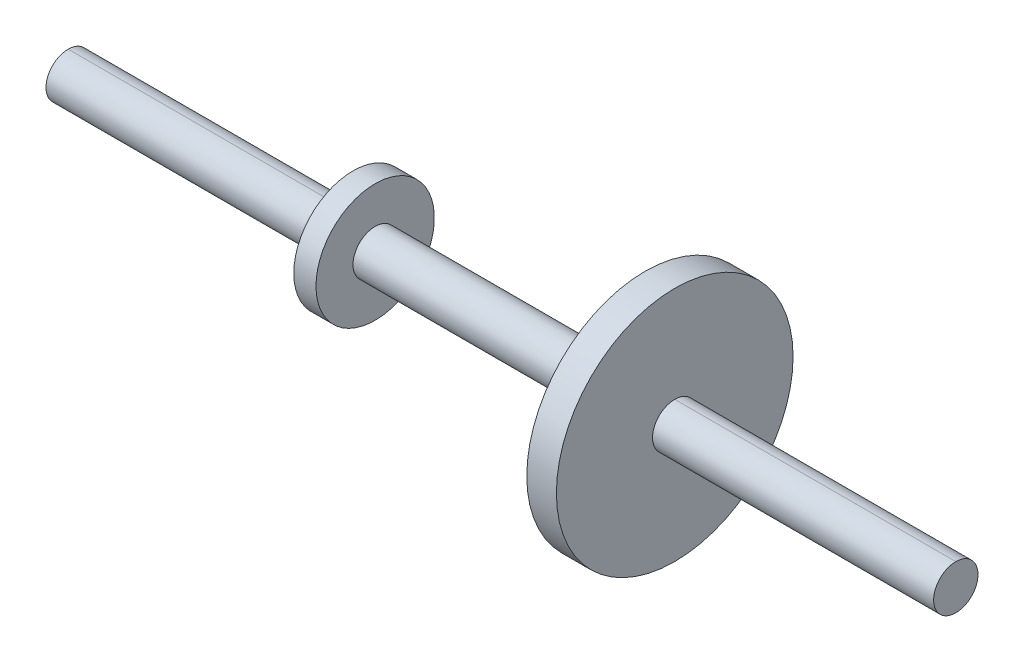
ISO-10303-21;
HEADER;
FILE_DESCRIPTION(('STEP AP214'),'2;1');
FILE_NAME('part.step','',(''),(''),'','','');
FILE_SCHEMA(('AUTOMOTIVE_DESIGN { 1 0 10303 214 1 1 1 1 }'));
ENDSEC;
DATA;
#1=APPLICATION_CONTEXT('core data for automotive mechanical design processes');
#2=APPLICATION_PROTOCOL_DEFINITION('international standard','automotive_design',2000,#1);
#3=PRODUCT_CONTEXT('',#1,'mechanical');
#4=PRODUCT('Part','Part','',(#3));
#5=PRODUCT_RELATED_PRODUCT_CATEGORY('part','',(#4));
#6=PRODUCT_DEFINITION_FORMATION('','',#4);
#7=PRODUCT_DEFINITION_CONTEXT('part definition',#1,'design');
#8=PRODUCT_DEFINITION('design','',#6,#7);
#9=PRODUCT_DEFINITION_SHAPE('','',#8);
#10=(LENGTH_UNIT() NAMED_UNIT(*) SI_UNIT(.MILLI.,.METRE.));
#11=(NAMED_UNIT(*) PLANE_ANGLE_UNIT() SI_UNIT($,.RADIAN.));
#12=(NAMED_UNIT(*) SI_UNIT($,.STERADIAN.) SOLID_ANGLE_UNIT());
#13=UNCERTAINTY_MEASURE_WITH_UNIT(LENGTH_MEASURE(1.E-05),#10,'distance_accuracy_value','');
#14=(GEOMETRIC_REPRESENTATION_CONTEXT(3) GLOBAL_UNCERTAINTY_ASSIGNED_CONTEXT((#13)) GLOBAL_UNIT_ASSIGNED_CONTEXT((#10,
#11,#12)) REPRESENTATION_CONTEXT('',''));
#15=CARTESIAN_POINT('',(0.,0.,0.));
#16=DIRECTION('',(0.,0.,1.));
#17=DIRECTION('',(1.,0.,0.));
#18=AXIS2_PLACEMENT_3D('',#15,#16,#17);
#19=CARTESIAN_POINT('',(0.,0.,0.));
#20=DIRECTION('',(-1.,0.,0.));
#21=DIRECTION('',(0.,0.,1.));
#22=AXIS2_PLACEMENT_3D('',#19,#20,#21);
#23=CYLINDRICAL_SURFACE('',#22,19.05);
#24=CARTESIAN_POINT('',(762.,0.,0.));
#25=DIRECTION('',(-1.,0.,0.));
#26=DIRECTION('',(0.,0.,1.));
#27=AXIS2_PLACEMENT_3D('',#24,#25,#26);
#28=CIRCLE('',#27,19.05);
#29=CARTESIAN_POINT('',(762.,19.05,0.));
#30=VERTEX_POINT('',#29);
#31=CARTESIAN_POINT('',(762.,-19.05,0.));
#32=VERTEX_POINT('',#31);
#33=EDGE_CURVE('E98',#30,#32,#28,.T.);
#34=ORIENTED_EDGE('',*,*,#33,.T.);
#35=DIRECTION('',(-1.,0.,0.));
#36=VECTOR('',#35,1.);
#37=CARTESIAN_POINT('',(0.,-19.05,0.));
#38=LINE('',#37,#36);
#39=CARTESIAN_POINT('',(520.7,-19.05,0.));
#40=VERTEX_POINT('',#39);
#41=EDGE_CURVE('E12',#32,#40,#38,.T.);
#42=ORIENTED_EDGE('',*,*,#41,.T.);
#43=CARTESIAN_POINT('',(520.7,0.,0.));
#44=DIRECTION('',(-1.,0.,0.));
#45=DIRECTION('',(0.,0.,1.));
#46=AXIS2_PLACEMENT_3D('',#43,#44,#45);
#47=CIRCLE('',#46,19.05);
#48=CARTESIAN_POINT('',(520.7,19.05,0.));
#49=VERTEX_POINT('',#48);
#50=EDGE_CURVE('E126',#49,#40,#47,.T.);
#51=ORIENTED_EDGE('',*,*,#50,.F.);
#52=DIRECTION('',(1.,0.,0.));
#53=VECTOR('',#52,1.);
#54=CARTESIAN_POINT('',(0.,19.05,0.));
#55=LINE('',#54,#53);
#56=EDGE_CURVE('E53',#49,#30,#55,.T.);
#57=ORIENTED_EDGE('',*,*,#56,.T.);
#58=EDGE_LOOP('',(#34,#42,#51,#57));
#59=FACE_BOUND('',#58,.T.);
#60=ADVANCED_FACE('F43',(#59),#23,.T.);
#61=CARTESIAN_POINT('',(0.,0.,0.));
#62=DIRECTION('',(-1.,0.,0.));
#63=DIRECTION('',(0.,0.,1.));
#64=AXIS2_PLACEMENT_3D('',#61,#62,#63);
#65=CYLINDRICAL_SURFACE('',#64,19.0499999999999);
#66=CARTESIAN_POINT('',(244.475,0.,0.));
#67=DIRECTION('',(-1.,0.,0.));
#68=DIRECTION('',(0.,0.,1.));
#69=AXIS2_PLACEMENT_3D('',#66,#67,#68);
#70=CIRCLE('',#69,19.0499999999999);
#71=CARTESIAN_POINT('',(244.475,-19.0499999999999,0.));
#72=VERTEX_POINT('',#71);
#73=CARTESIAN_POINT('',(244.475,19.0499999999999,0.));
#74=VERTEX_POINT('',#73);
#75=EDGE_CURVE('E101',#72,#74,#70,.T.);
#76=ORIENTED_EDGE('',*,*,#75,.T.);
#77=DIRECTION('',(-1.,0.,0.));
#78=VECTOR('',#77,1.);
#79=CARTESIAN_POINT('',(0.,19.0499999999999,0.));
#80=LINE('',#79,#78);
#81=CARTESIAN_POINT('',(0.,19.0499999999999,0.));
#82=VERTEX_POINT('',#81);
#83=EDGE_CURVE('E97',#74,#82,#80,.T.);
#84=ORIENTED_EDGE('',*,*,#83,.T.);
#85=CARTESIAN_POINT('',(0.,0.,0.));
#86=DIRECTION('',(-1.,0.,0.));
#87=DIRECTION('',(0.,0.,1.));
#88=AXIS2_PLACEMENT_3D('',#85,#86,#87);
#89=CIRCLE('',#88,19.0499999999999);
#90=CARTESIAN_POINT('',(0.,-19.0499999999999,0.));
#91=VERTEX_POINT('',#90);
#92=EDGE_CURVE('E86',#91,#82,#89,.T.);
#93=ORIENTED_EDGE('',*,*,#92,.F.);
#94=DIRECTION('',(1.,0.,0.));
#95=VECTOR('',#94,1.);
#96=CARTESIAN_POINT('',(0.,-19.0499999999999,0.));
#97=LINE('',#96,#95);
#98=EDGE_CURVE('E89',#91,#72,#97,.T.);
#99=ORIENTED_EDGE('',*,*,#98,.T.);
#100=EDGE_LOOP('',(#76,#84,#93,#99));
#101=FACE_BOUND('',#100,.T.);
#102=ADVANCED_FACE('F100',(#101),#65,.T.);
#103=CARTESIAN_POINT('',(0.,0.,-19.0499999999999));
#104=DIRECTION('',(1.,0.,0.));
#105=DIRECTION('',(0.,0.,-1.));
#106=AXIS2_PLACEMENT_3D('',#103,#104,#105);
#107=PLANE('',#106);
#108=ORIENTED_EDGE('',*,*,#92,.T.);
#109=EDGE_CURVE('E83',#82,#91,#89,.T.);
#110=ORIENTED_EDGE('',*,*,#109,.T.);
#111=EDGE_LOOP('',(#108,#110));
#112=FACE_BOUND('',#111,.T.);
#113=ADVANCED_FACE('F45',(#112),#107,.F.);
#114=CARTESIAN_POINT('',(762.,0.,0.));
#115=DIRECTION('',(-1.,0.,0.));
#116=DIRECTION('',(0.,0.,1.));
#117=AXIS2_PLACEMENT_3D('',#114,#115,#116);
#118=PLANE('',#117);
#119=ORIENTED_EDGE('',*,*,#33,.F.);
#120=EDGE_CURVE('E129',#32,#30,#28,.T.);
#121=ORIENTED_EDGE('',*,*,#120,.F.);
#122=EDGE_LOOP('',(#119,#121));
#123=FACE_BOUND('',#122,.T.);
#124=ADVANCED_FACE('F141',(#123),#118,.F.);
#125=ORIENTED_EDGE('',*,*,#41,.F.);
#126=ORIENTED_EDGE('',*,*,#120,.T.);
#127=ORIENTED_EDGE('',*,*,#56,.F.);
#128=EDGE_CURVE('E122',#40,#49,#47,.T.);
#129=ORIENTED_EDGE('',*,*,#128,.F.);
#130=EDGE_LOOP('',(#125,#126,#127,#129));
#131=FACE_BOUND('',#130,.T.);
#132=ADVANCED_FACE('F142',(#131),#23,.T.);
#133=CARTESIAN_POINT('',(520.7,0.,-19.05));
#134=DIRECTION('',(-1.,0.,0.));
#135=DIRECTION('',(0.,0.,1.));
#136=AXIS2_PLACEMENT_3D('',#133,#134,#135);
#137=PLANE('',#136);
#138=CARTESIAN_POINT('',(520.7,0.,0.));
#139=DIRECTION('',(-1.,0.,0.));
#140=DIRECTION('',(0.,0.,1.));
#141=AXIS2_PLACEMENT_3D('',#138,#139,#140);
#142=CIRCLE('',#141,101.6);
#143=CARTESIAN_POINT('',(520.7,0.,101.6));
#144=VERTEX_POINT('',#143);
#145=EDGE_CURVE('E118',#144,#144,#142,.T.);
#146=ORIENTED_EDGE('',*,*,#145,.F.);
#147=EDGE_LOOP('',(#146));
#148=FACE_BOUND('',#147,.T.);
#149=ORIENTED_EDGE('',*,*,#50,.T.);
#150=ORIENTED_EDGE('',*,*,#128,.T.);
#151=EDGE_LOOP('',(#149,#150));
#152=FACE_BOUND('',#151,.T.);
#153=ADVANCED_FACE('F144',(#148,#152),#137,.F.);
#154=CARTESIAN_POINT('',(0.,0.,0.));
#155=DIRECTION('',(-1.,0.,0.));
#156=DIRECTION('',(0.,0.,1.));
#157=AXIS2_PLACEMENT_3D('',#154,#155,#156);
#158=CYLINDRICAL_SURFACE('',#157,101.6);
#159=CARTESIAN_POINT('',(495.3,0.,0.));
#160=DIRECTION('',(-1.,0.,0.));
#161=DIRECTION('',(0.,0.,1.));
#162=AXIS2_PLACEMENT_3D('',#159,#160,#161);
#163=CIRCLE('',#162,101.6);
#164=CARTESIAN_POINT('',(495.3,0.,101.6));
#165=VERTEX_POINT('',#164);
#166=EDGE_CURVE('E123',#165,#165,#163,.T.);
#167=ORIENTED_EDGE('',*,*,#166,.F.);
#168=EDGE_LOOP('',(#167));
#169=FACE_BOUND('',#168,.T.);
#170=ORIENTED_EDGE('',*,*,#145,.T.);
#171=EDGE_LOOP('',(#170));
#172=FACE_BOUND('',#171,.T.);
#173=ADVANCED_FACE('F150',(#169,#172),#158,.T.);
#174=CARTESIAN_POINT('',(495.3,0.,-101.6));
#175=DIRECTION('',(1.,0.,0.));
#176=DIRECTION('',(0.,0.,-1.));
#177=AXIS2_PLACEMENT_3D('',#174,#175,#176);
#178=PLANE('',#177);
#179=CARTESIAN_POINT('',(495.3,0.,0.));
#180=DIRECTION('',(-1.,0.,0.));
#181=DIRECTION('',(0.,0.,1.));
#182=AXIS2_PLACEMENT_3D('',#179,#180,#181);
#183=CIRCLE('',#182,19.05);
#184=CARTESIAN_POINT('',(495.3,0.,19.05));
#185=VERTEX_POINT('',#184);
#186=EDGE_CURVE('E198',#185,#185,#183,.T.);
#187=ORIENTED_EDGE('',*,*,#186,.F.);
#188=EDGE_LOOP('',(#187));
#189=FACE_BOUND('',#188,.T.);
#190=ORIENTED_EDGE('',*,*,#166,.T.);
#191=EDGE_LOOP('',(#190));
#192=FACE_BOUND('',#191,.T.);
#193=ADVANCED_FACE('F183',(#189,#192),#178,.F.);
#194=CARTESIAN_POINT('',(0.,0.,0.));
#195=DIRECTION('',(-1.,0.,0.));
#196=DIRECTION('',(0.,0.,1.));
#197=AXIS2_PLACEMENT_3D('',#194,#195,#196);
#198=CYLINDRICAL_SURFACE('',#197,19.05);
#199=CARTESIAN_POINT('',(263.525,0.,0.));
#200=DIRECTION('',(-1.,0.,0.));
#201=DIRECTION('',(0.,0.,1.));
#202=AXIS2_PLACEMENT_3D('',#199,#200,#201);
#203=CIRCLE('',#202,19.0499999999999);
#204=CARTESIAN_POINT('',(263.525,0.,19.0499999999999));
#205=VERTEX_POINT('',#204);
#206=EDGE_CURVE('E200',#205,#205,#203,.T.);
#207=ORIENTED_EDGE('',*,*,#206,.F.);
#208=EDGE_LOOP('',(#207));
#209=FACE_BOUND('',#208,.T.);
#210=ORIENTED_EDGE('',*,*,#186,.T.);
#211=EDGE_LOOP('',(#210));
#212=FACE_BOUND('',#211,.T.);
#213=ADVANCED_FACE('F179',(#209,#212),#198,.T.);
#214=CARTESIAN_POINT('',(263.525,0.,-19.0499999999999));
#215=DIRECTION('',(-1.,0.,0.));
#216=DIRECTION('',(0.,0.,1.));
#217=AXIS2_PLACEMENT_3D('',#214,#215,#216);
#218=PLANE('',#217);
#219=CARTESIAN_POINT('',(263.525,0.,0.));
#220=DIRECTION('',(-1.,0.,0.));
#221=DIRECTION('',(0.,0.,1.));
#222=AXIS2_PLACEMENT_3D('',#219,#220,#221);
#223=CIRCLE('',#222,50.8);
#224=CARTESIAN_POINT('',(263.525,0.,50.8));
#225=VERTEX_POINT('',#224);
#226=EDGE_CURVE('E109',#225,#225,#223,.T.);
#227=ORIENTED_EDGE('',*,*,#226,.F.);
#228=EDGE_LOOP('',(#227));
#229=FACE_BOUND('',#228,.T.);
#230=ORIENTED_EDGE('',*,*,#206,.T.);
#231=EDGE_LOOP('',(#230));
#232=FACE_BOUND('',#231,.T.);
#233=ADVANCED_FACE('F172',(#229,#232),#218,.F.);
#234=CARTESIAN_POINT('',(0.,0.,0.));
#235=DIRECTION('',(-1.,0.,0.));
#236=DIRECTION('',(0.,0.,1.));
#237=AXIS2_PLACEMENT_3D('',#234,#235,#236);
#238=CYLINDRICAL_SURFACE('',#237,50.8);
#239=CARTESIAN_POINT('',(244.475,0.,0.));
#240=DIRECTION('',(-1.,0.,0.));
#241=DIRECTION('',(0.,0.,1.));
#242=AXIS2_PLACEMENT_3D('',#239,#240,#241);
#243=CIRCLE('',#242,50.8);
#244=CARTESIAN_POINT('',(244.475,0.,50.8));
#245=VERTEX_POINT('',#244);
#246=EDGE_CURVE('E105',#245,#245,#243,.T.);
#247=ORIENTED_EDGE('',*,*,#246,.F.);
#248=EDGE_LOOP('',(#247));
#249=FACE_BOUND('',#248,.T.);
#250=ORIENTED_EDGE('',*,*,#226,.T.);
#251=EDGE_LOOP('',(#250));
#252=FACE_BOUND('',#251,.T.);
#253=ADVANCED_FACE('F167',(#249,#252),#238,.T.);
#254=CARTESIAN_POINT('',(244.475,0.,-50.8));
#255=DIRECTION('',(1.,0.,0.));
#256=DIRECTION('',(0.,0.,-1.));
#257=AXIS2_PLACEMENT_3D('',#254,#255,#256);
#258=PLANE('',#257);
#259=ORIENTED_EDGE('',*,*,#75,.F.);
#260=EDGE_CURVE('E92',#74,#72,#70,.T.);
#261=ORIENTED_EDGE('',*,*,#260,.F.);
#262=EDGE_LOOP('',(#259,#261));
#263=FACE_BOUND('',#262,.T.);
#264=ORIENTED_EDGE('',*,*,#246,.T.);
#265=EDGE_LOOP('',(#264));
#266=FACE_BOUND('',#265,.T.);
#267=ADVANCED_FACE('F163',(#263,#266),#258,.F.);
#268=ORIENTED_EDGE('',*,*,#83,.F.);
#269=ORIENTED_EDGE('',*,*,#260,.T.);
#270=ORIENTED_EDGE('',*,*,#98,.F.);
#271=ORIENTED_EDGE('',*,*,#109,.F.);
#272=EDGE_LOOP('',(#268,#269,#270,#271));
#273=FACE_BOUND('',#272,.T.);
#274=ADVANCED_FACE('F90',(#273),#65,.T.);
#275=CLOSED_SHELL('',(#60,#102,#113,#124,#132,#153,#173,#193,#213,#233,#253,#267,#274));
#276=MANIFOLD_SOLID_BREP('B2',#275);
#277=ADVANCED_BREP_SHAPE_REPRESENTATION('',(#18,#276),#14);
#278=SHAPE_DEFINITION_REPRESENTATION(#9,#277);
ENDSEC;
END-ISO-10303-21;
